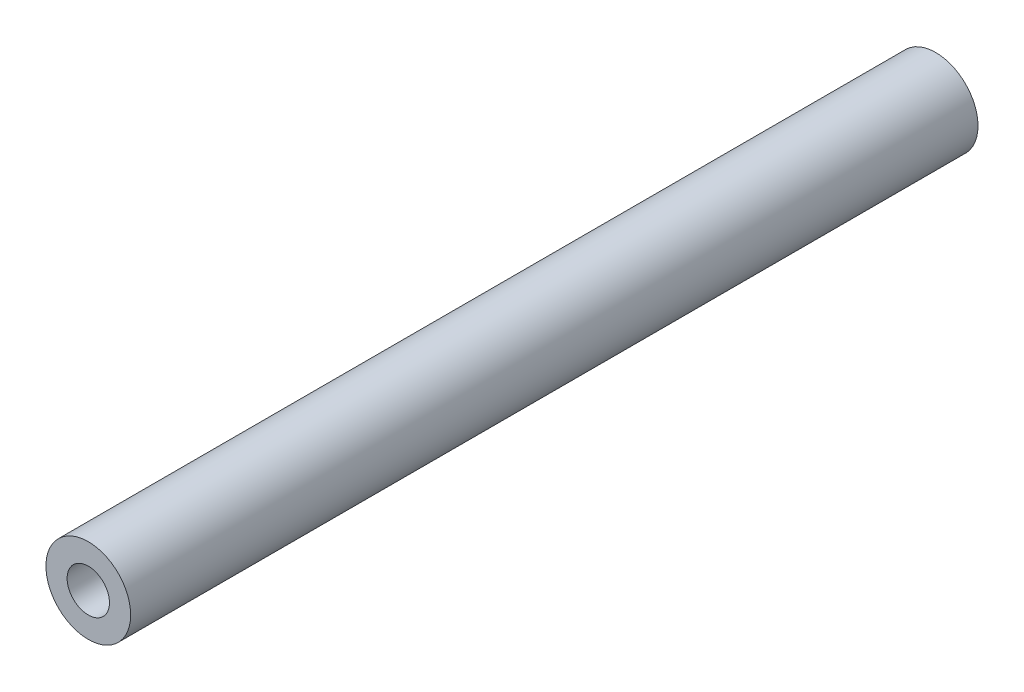
ISO-10303-21;
HEADER;
FILE_DESCRIPTION(('STEP AP214'),'2;1');
FILE_NAME('part.step','',(''),(''),'','','');
FILE_SCHEMA(('AUTOMOTIVE_DESIGN { 1 0 10303 214 1 1 1 1 }'));
ENDSEC;
DATA;
#1=APPLICATION_CONTEXT('core data for automotive mechanical design processes');
#2=APPLICATION_PROTOCOL_DEFINITION('international standard','automotive_design',2000,#1);
#3=PRODUCT_CONTEXT('',#1,'mechanical');
#4=PRODUCT('Part','Part','',(#3));
#5=PRODUCT_RELATED_PRODUCT_CATEGORY('part','',(#4));
#6=PRODUCT_DEFINITION_FORMATION('','',#4);
#7=PRODUCT_DEFINITION_CONTEXT('part definition',#1,'design');
#8=PRODUCT_DEFINITION('design','',#6,#7);
#9=PRODUCT_DEFINITION_SHAPE('','',#8);
#10=(LENGTH_UNIT() NAMED_UNIT(*) SI_UNIT(.MILLI.,.METRE.));
#11=(NAMED_UNIT(*) PLANE_ANGLE_UNIT() SI_UNIT($,.RADIAN.));
#12=(NAMED_UNIT(*) SI_UNIT($,.STERADIAN.) SOLID_ANGLE_UNIT());
#13=UNCERTAINTY_MEASURE_WITH_UNIT(LENGTH_MEASURE(1.E-05),#10,'distance_accuracy_value','');
#14=(GEOMETRIC_REPRESENTATION_CONTEXT(3) GLOBAL_UNCERTAINTY_ASSIGNED_CONTEXT((#13)) GLOBAL_UNIT_ASSIGNED_CONTEXT((#10,
#11,#12)) REPRESENTATION_CONTEXT('',''));
#15=CARTESIAN_POINT('',(0.,0.,0.));
#16=DIRECTION('',(0.,0.,1.));
#17=DIRECTION('',(1.,0.,0.));
#18=AXIS2_PLACEMENT_3D('',#15,#16,#17);
#19=CARTESIAN_POINT('',(0.,0.,30.));
#20=DIRECTION('',(0.,0.,1.));
#21=DIRECTION('',(1.,0.,0.));
#22=AXIS2_PLACEMENT_3D('',#19,#20,#21);
#23=PLANE('',#22);
#24=CARTESIAN_POINT('',(0.,0.,30.));
#25=DIRECTION('',(0.,0.,1.));
#26=DIRECTION('',(1.,0.,0.));
#27=AXIS2_PLACEMENT_3D('',#24,#25,#26);
#28=CIRCLE('',#27,3.);
#29=CARTESIAN_POINT('',(3.,0.,30.));
#30=VERTEX_POINT('',#29);
#31=EDGE_CURVE('E10',#30,#30,#28,.T.);
#32=ORIENTED_EDGE('',*,*,#31,.T.);
#33=EDGE_LOOP('',(#32));
#34=FACE_BOUND('',#33,.T.);
#35=CARTESIAN_POINT('',(0.,0.,30.));
#36=DIRECTION('',(0.,0.,1.));
#37=DIRECTION('',(1.,0.,0.));
#38=AXIS2_PLACEMENT_3D('',#35,#36,#37);
#39=CIRCLE('',#38,1.5);
#40=CARTESIAN_POINT('',(1.5,0.,30.));
#41=VERTEX_POINT('',#40);
#42=EDGE_CURVE('E42',#41,#41,#39,.T.);
#43=ORIENTED_EDGE('',*,*,#42,.F.);
#44=EDGE_LOOP('',(#43));
#45=FACE_BOUND('',#44,.T.);
#46=ADVANCED_FACE('F31',(#34,#45),#23,.T.);
#47=CARTESIAN_POINT('',(0.,0.,-30.));
#48=DIRECTION('',(0.,0.,1.));
#49=DIRECTION('',(1.,0.,0.));
#50=AXIS2_PLACEMENT_3D('',#47,#48,#49);
#51=PLANE('',#50);
#52=CARTESIAN_POINT('',(0.,0.,-30.));
#53=DIRECTION('',(0.,0.,1.));
#54=DIRECTION('',(1.,0.,0.));
#55=AXIS2_PLACEMENT_3D('',#52,#53,#54);
#56=CIRCLE('',#55,3.);
#57=CARTESIAN_POINT('',(3.,0.,-30.));
#58=VERTEX_POINT('',#57);
#59=EDGE_CURVE('E35',#58,#58,#56,.T.);
#60=ORIENTED_EDGE('',*,*,#59,.F.);
#61=EDGE_LOOP('',(#60));
#62=FACE_BOUND('',#61,.T.);
#63=CARTESIAN_POINT('',(0.,0.,-30.));
#64=DIRECTION('',(0.,0.,1.));
#65=DIRECTION('',(1.,0.,0.));
#66=AXIS2_PLACEMENT_3D('',#63,#64,#65);
#67=CIRCLE('',#66,1.5);
#68=CARTESIAN_POINT('',(1.5,0.,-30.));
#69=VERTEX_POINT('',#68);
#70=EDGE_CURVE('E44',#69,#69,#67,.T.);
#71=ORIENTED_EDGE('',*,*,#70,.T.);
#72=EDGE_LOOP('',(#71));
#73=FACE_BOUND('',#72,.T.);
#74=ADVANCED_FACE('F54',(#62,#73),#51,.F.);
#75=CARTESIAN_POINT('',(0.,0.,30.));
#76=DIRECTION('',(0.,0.,-1.));
#77=DIRECTION('',(-1.,0.,0.));
#78=AXIS2_PLACEMENT_3D('',#75,#76,#77);
#79=CYLINDRICAL_SURFACE('',#78,3.);
#80=ORIENTED_EDGE('',*,*,#31,.F.);
#81=EDGE_LOOP('',(#80));
#82=FACE_BOUND('',#81,.T.);
#83=ORIENTED_EDGE('',*,*,#59,.T.);
#84=EDGE_LOOP('',(#83));
#85=FACE_BOUND('',#84,.T.);
#86=ADVANCED_FACE('F33',(#82,#85),#79,.T.);
#87=CARTESIAN_POINT('',(0.,0.,30.));
#88=DIRECTION('',(0.,0.,-1.));
#89=DIRECTION('',(-1.,0.,0.));
#90=AXIS2_PLACEMENT_3D('',#87,#88,#89);
#91=CYLINDRICAL_SURFACE('',#90,1.5);
#92=ORIENTED_EDGE('',*,*,#42,.T.);
#93=EDGE_LOOP('',(#92));
#94=FACE_BOUND('',#93,.T.);
#95=ORIENTED_EDGE('',*,*,#70,.F.);
#96=EDGE_LOOP('',(#95));
#97=FACE_BOUND('',#96,.T.);
#98=ADVANCED_FACE('F50',(#94,#97),#91,.F.);
#99=CLOSED_SHELL('',(#46,#74,#86,#98));
#100=MANIFOLD_SOLID_BREP('B2',#99);
#101=ADVANCED_BREP_SHAPE_REPRESENTATION('',(#18,#100),#14);
#102=SHAPE_DEFINITION_REPRESENTATION(#9,#101);
ENDSEC;
END-ISO-10303-21;
